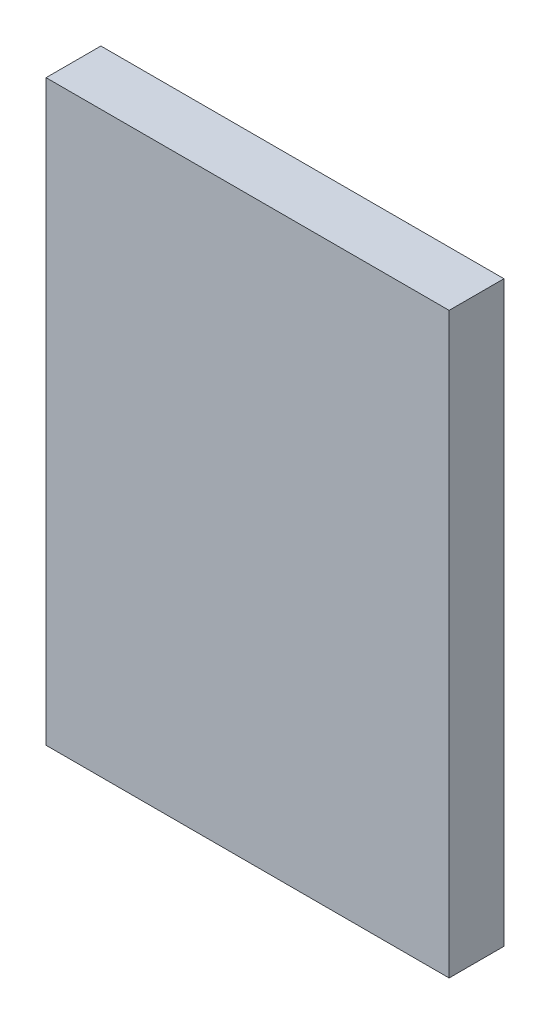
ISO-10303-21;
HEADER;
FILE_DESCRIPTION(('STEP AP214'),'2;1');
FILE_NAME('part.step','',(''),(''),'','','');
FILE_SCHEMA(('AUTOMOTIVE_DESIGN { 1 0 10303 214 1 1 1 1 }'));
ENDSEC;
DATA;
#1=APPLICATION_CONTEXT('core data for automotive mechanical design processes');
#2=APPLICATION_PROTOCOL_DEFINITION('international standard','automotive_design',2000,#1);
#3=PRODUCT_CONTEXT('',#1,'mechanical');
#4=PRODUCT('Part','Part','',(#3));
#5=PRODUCT_RELATED_PRODUCT_CATEGORY('part','',(#4));
#6=PRODUCT_DEFINITION_FORMATION('','',#4);
#7=PRODUCT_DEFINITION_CONTEXT('part definition',#1,'design');
#8=PRODUCT_DEFINITION('design','',#6,#7);
#9=PRODUCT_DEFINITION_SHAPE('','',#8);
#10=(LENGTH_UNIT() NAMED_UNIT(*) SI_UNIT(.MILLI.,.METRE.));
#11=(NAMED_UNIT(*) PLANE_ANGLE_UNIT() SI_UNIT($,.RADIAN.));
#12=(NAMED_UNIT(*) SI_UNIT($,.STERADIAN.) SOLID_ANGLE_UNIT());
#13=UNCERTAINTY_MEASURE_WITH_UNIT(LENGTH_MEASURE(1.E-05),#10,'distance_accuracy_value','');
#14=(GEOMETRIC_REPRESENTATION_CONTEXT(3) GLOBAL_UNCERTAINTY_ASSIGNED_CONTEXT((#13)) GLOBAL_UNIT_ASSIGNED_CONTEXT((#10,
#11,#12)) REPRESENTATION_CONTEXT('',''));
#15=CARTESIAN_POINT('',(0.,0.,0.));
#16=DIRECTION('',(0.,0.,1.));
#17=DIRECTION('',(1.,0.,0.));
#18=AXIS2_PLACEMENT_3D('',#15,#16,#17);
#19=CARTESIAN_POINT('',(-34.925,-58.2,9.5));
#20=DIRECTION('',(1.,0.,0.));
#21=DIRECTION('',(0.,0.,-1.));
#22=AXIS2_PLACEMENT_3D('',#19,#20,#21);
#23=PLANE('',#22);
#24=DIRECTION('',(0.,-1.,0.));
#25=VECTOR('',#24,1.);
#26=CARTESIAN_POINT('',(-34.925,-58.2,0.));
#27=LINE('',#26,#25);
#28=CARTESIAN_POINT('',(-34.925,42.,0.));
#29=VERTEX_POINT('',#28);
#30=CARTESIAN_POINT('',(-34.925,-58.2,0.));
#31=VERTEX_POINT('',#30);
#32=EDGE_CURVE('E104',#29,#31,#27,.T.);
#33=ORIENTED_EDGE('',*,*,#32,.T.);
#34=DIRECTION('',(0.,0.,-1.));
#35=VECTOR('',#34,1.);
#36=CARTESIAN_POINT('',(-34.925,-58.2,9.5));
#37=LINE('',#36,#35);
#38=CARTESIAN_POINT('',(-34.925,-58.2,9.5));
#39=VERTEX_POINT('',#38);
#40=EDGE_CURVE('E11',#39,#31,#37,.T.);
#41=ORIENTED_EDGE('',*,*,#40,.F.);
#42=DIRECTION('',(0.,-1.,0.));
#43=VECTOR('',#42,1.);
#44=CARTESIAN_POINT('',(-34.925,-58.2,9.5));
#45=LINE('',#44,#43);
#46=CARTESIAN_POINT('',(-34.925,42.,9.5));
#47=VERTEX_POINT('',#46);
#48=EDGE_CURVE('E92',#47,#39,#45,.T.);
#49=ORIENTED_EDGE('',*,*,#48,.F.);
#50=DIRECTION('',(0.,0.,-1.));
#51=VECTOR('',#50,1.);
#52=CARTESIAN_POINT('',(-34.925,42.,9.5));
#53=LINE('',#52,#51);
#54=EDGE_CURVE('E100',#47,#29,#53,.T.);
#55=ORIENTED_EDGE('',*,*,#54,.T.);
#56=EDGE_LOOP('',(#33,#41,#49,#55));
#57=FACE_BOUND('',#56,.T.);
#58=ADVANCED_FACE('F41',(#57),#23,.F.);
#59=CARTESIAN_POINT('',(-34.925,-58.2,9.5));
#60=DIRECTION('',(0.,1.,0.));
#61=DIRECTION('',(0.,0.,1.));
#62=AXIS2_PLACEMENT_3D('',#59,#60,#61);
#63=PLANE('',#62);
#64=DIRECTION('',(1.,0.,0.));
#65=VECTOR('',#64,1.);
#66=CARTESIAN_POINT('',(-34.925,-58.2,0.));
#67=LINE('',#66,#65);
#68=CARTESIAN_POINT('',(34.925,-58.2,0.));
#69=VERTEX_POINT('',#68);
#70=EDGE_CURVE('E96',#31,#69,#67,.T.);
#71=ORIENTED_EDGE('',*,*,#70,.T.);
#72=DIRECTION('',(0.,0.,-1.));
#73=VECTOR('',#72,1.);
#74=CARTESIAN_POINT('',(34.925,-58.2,9.5));
#75=LINE('',#74,#73);
#76=CARTESIAN_POINT('',(34.925,-58.2,9.5));
#77=VERTEX_POINT('',#76);
#78=EDGE_CURVE('E49',#77,#69,#75,.T.);
#79=ORIENTED_EDGE('',*,*,#78,.F.);
#80=DIRECTION('',(1.,0.,0.));
#81=VECTOR('',#80,1.);
#82=CARTESIAN_POINT('',(-34.925,-58.2,9.5));
#83=LINE('',#82,#81);
#84=EDGE_CURVE('E87',#39,#77,#83,.T.);
#85=ORIENTED_EDGE('',*,*,#84,.F.);
#86=ORIENTED_EDGE('',*,*,#40,.T.);
#87=EDGE_LOOP('',(#71,#79,#85,#86));
#88=FACE_BOUND('',#87,.T.);
#89=ADVANCED_FACE('F95',(#88),#63,.F.);
#90=CARTESIAN_POINT('',(34.925,-58.2,9.5));
#91=DIRECTION('',(-1.,0.,0.));
#92=DIRECTION('',(0.,0.,1.));
#93=AXIS2_PLACEMENT_3D('',#90,#91,#92);
#94=PLANE('',#93);
#95=DIRECTION('',(0.,1.,0.));
#96=VECTOR('',#95,1.);
#97=CARTESIAN_POINT('',(34.925,-58.2,0.));
#98=LINE('',#97,#96);
#99=CARTESIAN_POINT('',(34.925,42.,0.));
#100=VERTEX_POINT('',#99);
#101=EDGE_CURVE('E74',#69,#100,#98,.T.);
#102=ORIENTED_EDGE('',*,*,#101,.T.);
#103=DIRECTION('',(0.,0.,-1.));
#104=VECTOR('',#103,1.);
#105=CARTESIAN_POINT('',(34.925,42.,9.5));
#106=LINE('',#105,#104);
#107=CARTESIAN_POINT('',(34.925,42.,9.5));
#108=VERTEX_POINT('',#107);
#109=EDGE_CURVE('E97',#108,#100,#106,.T.);
#110=ORIENTED_EDGE('',*,*,#109,.F.);
#111=DIRECTION('',(0.,1.,0.));
#112=VECTOR('',#111,1.);
#113=CARTESIAN_POINT('',(34.925,-58.2,9.5));
#114=LINE('',#113,#112);
#115=EDGE_CURVE('E90',#77,#108,#114,.T.);
#116=ORIENTED_EDGE('',*,*,#115,.F.);
#117=ORIENTED_EDGE('',*,*,#78,.T.);
#118=EDGE_LOOP('',(#102,#110,#116,#117));
#119=FACE_BOUND('',#118,.T.);
#120=ADVANCED_FACE('F98',(#119),#94,.F.);
#121=CARTESIAN_POINT('',(-34.925,42.,9.5));
#122=DIRECTION('',(0.,-1.,0.));
#123=DIRECTION('',(0.,0.,-1.));
#124=AXIS2_PLACEMENT_3D('',#121,#122,#123);
#125=PLANE('',#124);
#126=DIRECTION('',(-1.,0.,0.));
#127=VECTOR('',#126,1.);
#128=CARTESIAN_POINT('',(-34.925,42.,0.));
#129=LINE('',#128,#127);
#130=EDGE_CURVE('E80',#100,#29,#129,.T.);
#131=ORIENTED_EDGE('',*,*,#130,.T.);
#132=ORIENTED_EDGE('',*,*,#54,.F.);
#133=DIRECTION('',(-1.,0.,0.));
#134=VECTOR('',#133,1.);
#135=CARTESIAN_POINT('',(-34.925,42.,9.5));
#136=LINE('',#135,#134);
#137=EDGE_CURVE('E57',#108,#47,#136,.T.);
#138=ORIENTED_EDGE('',*,*,#137,.F.);
#139=ORIENTED_EDGE('',*,*,#109,.T.);
#140=EDGE_LOOP('',(#131,#132,#138,#139));
#141=FACE_BOUND('',#140,.T.);
#142=ADVANCED_FACE('F111',(#141),#125,.F.);
#143=CARTESIAN_POINT('',(0.,0.,9.5));
#144=DIRECTION('',(0.,0.,-1.));
#145=DIRECTION('',(-1.,0.,0.));
#146=AXIS2_PLACEMENT_3D('',#143,#144,#145);
#147=PLANE('',#146);
#148=ORIENTED_EDGE('',*,*,#48,.T.);
#149=ORIENTED_EDGE('',*,*,#84,.T.);
#150=ORIENTED_EDGE('',*,*,#115,.T.);
#151=ORIENTED_EDGE('',*,*,#137,.T.);
#152=EDGE_LOOP('',(#148,#149,#150,#151));
#153=FACE_BOUND('',#152,.T.);
#154=ADVANCED_FACE('F88',(#153),#147,.F.);
#155=CARTESIAN_POINT('',(0.,0.,0.));
#156=DIRECTION('',(0.,0.,-1.));
#157=DIRECTION('',(-1.,0.,0.));
#158=AXIS2_PLACEMENT_3D('',#155,#156,#157);
#159=PLANE('',#158);
#160=ORIENTED_EDGE('',*,*,#32,.F.);
#161=ORIENTED_EDGE('',*,*,#130,.F.);
#162=ORIENTED_EDGE('',*,*,#101,.F.);
#163=ORIENTED_EDGE('',*,*,#70,.F.);
#164=EDGE_LOOP('',(#160,#161,#162,#163));
#165=FACE_BOUND('',#164,.T.);
#166=ADVANCED_FACE('F114',(#165),#159,.T.);
#167=CLOSED_SHELL('',(#58,#89,#120,#142,#154,#166));
#168=MANIFOLD_SOLID_BREP('B2',#167);
#169=ADVANCED_BREP_SHAPE_REPRESENTATION('',(#18,#168),#14);
#170=SHAPE_DEFINITION_REPRESENTATION(#9,#169);
ENDSEC;
END-ISO-10303-21;
